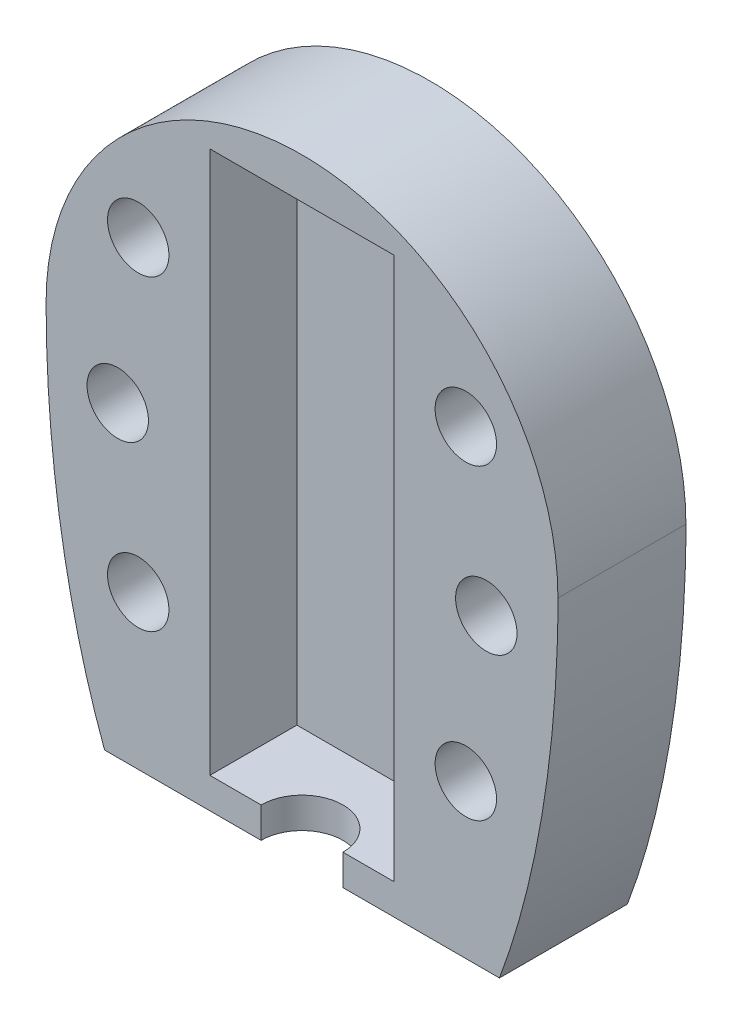
ISO-10303-21;
HEADER;
FILE_DESCRIPTION(('STEP AP214'),'2;1');
FILE_NAME('part.step','',(''),(''),'','','');
FILE_SCHEMA(('AUTOMOTIVE_DESIGN { 1 0 10303 214 1 1 1 1 }'));
ENDSEC;
DATA;
#1=APPLICATION_CONTEXT('core data for automotive mechanical design processes');
#2=APPLICATION_PROTOCOL_DEFINITION('international standard','automotive_design',2000,#1);
#3=PRODUCT_CONTEXT('',#1,'mechanical');
#4=PRODUCT('Part','Part','',(#3));
#5=PRODUCT_RELATED_PRODUCT_CATEGORY('part','',(#4));
#6=PRODUCT_DEFINITION_FORMATION('','',#4);
#7=PRODUCT_DEFINITION_CONTEXT('part definition',#1,'design');
#8=PRODUCT_DEFINITION('design','',#6,#7);
#9=PRODUCT_DEFINITION_SHAPE('','',#8);
#10=(LENGTH_UNIT() NAMED_UNIT(*) SI_UNIT(.MILLI.,.METRE.));
#11=(NAMED_UNIT(*) PLANE_ANGLE_UNIT() SI_UNIT($,.RADIAN.));
#12=(NAMED_UNIT(*) SI_UNIT($,.STERADIAN.) SOLID_ANGLE_UNIT());
#13=UNCERTAINTY_MEASURE_WITH_UNIT(LENGTH_MEASURE(1.E-05),#10,'distance_accuracy_value','');
#14=(GEOMETRIC_REPRESENTATION_CONTEXT(3) GLOBAL_UNCERTAINTY_ASSIGNED_CONTEXT((#13)) GLOBAL_UNIT_ASSIGNED_CONTEXT((#10,
#11,#12)) REPRESENTATION_CONTEXT('',''));
#15=CARTESIAN_POINT('',(0.,0.,0.));
#16=DIRECTION('',(0.,0.,1.));
#17=DIRECTION('',(1.,0.,0.));
#18=AXIS2_PLACEMENT_3D('',#15,#16,#17);
#19=CARTESIAN_POINT('',(0.,0.,12.5));
#20=DIRECTION('',(0.,0.,1.));
#21=DIRECTION('',(0.,-1.,0.));
#22=AXIS2_PLACEMENT_3D('',#19,#20,#21);
#23=ELLIPSE('',#22,55.,25.);
#24=DIRECTION('',(0.,0.,-1.));
#25=VECTOR('',#24,1.);
#26=SURFACE_OF_LINEAR_EXTRUSION('',#23,#25);
#27=CARTESIAN_POINT('',(0.,0.,0.));
#28=DIRECTION('',(0.,0.,1.));
#29=DIRECTION('',(0.,-1.,0.));
#30=AXIS2_PLACEMENT_3D('',#27,#28,#29);
#31=ELLIPSE('',#30,55.,25.);
#32=CARTESIAN_POINT('',(19.2847303959968,-35.,0.));
#33=VERTEX_POINT('',#32);
#34=CARTESIAN_POINT('',(25.,0.,0.));
#35=VERTEX_POINT('',#34);
#36=EDGE_CURVE('E138',#33,#35,#31,.T.);
#37=ORIENTED_EDGE('',*,*,#36,.T.);
#38=DIRECTION('',(0.,0.,-1.));
#39=VECTOR('',#38,1.);
#40=CARTESIAN_POINT('',(25.,0.,12.5));
#41=LINE('',#40,#39);
#42=CARTESIAN_POINT('',(25.,0.,12.5));
#43=VERTEX_POINT('',#42);
#44=EDGE_CURVE('E41',#43,#35,#41,.T.);
#45=ORIENTED_EDGE('',*,*,#44,.F.);
#46=CARTESIAN_POINT('',(19.2847303959968,-35.,12.5));
#47=VERTEX_POINT('',#46);
#48=EDGE_CURVE('E148',#47,#43,#23,.T.);
#49=ORIENTED_EDGE('',*,*,#48,.F.);
#50=DIRECTION('',(0.,0.,-1.));
#51=VECTOR('',#50,1.);
#52=CARTESIAN_POINT('',(19.2847303959968,-35.,12.5));
#53=LINE('',#52,#51);
#54=EDGE_CURVE('E128',#47,#33,#53,.T.);
#55=ORIENTED_EDGE('',*,*,#54,.T.);
#56=EDGE_LOOP('',(#37,#45,#49,#55));
#57=FACE_BOUND('',#56,.T.);
#58=ADVANCED_FACE('F33',(#57),#26,.F.);
#59=CARTESIAN_POINT('',(0.,0.,12.5));
#60=DIRECTION('',(0.,0.,-1.));
#61=DIRECTION('',(-1.,0.,0.));
#62=AXIS2_PLACEMENT_3D('',#59,#60,#61);
#63=CYLINDRICAL_SURFACE('',#62,25.);
#64=CARTESIAN_POINT('',(0.,0.,0.));
#65=DIRECTION('',(0.,0.,1.));
#66=DIRECTION('',(1.,0.,0.));
#67=AXIS2_PLACEMENT_3D('',#64,#65,#66);
#68=CIRCLE('',#67,25.);
#69=CARTESIAN_POINT('',(-25.,0.,0.));
#70=VERTEX_POINT('',#69);
#71=EDGE_CURVE('E141',#35,#70,#68,.T.);
#72=ORIENTED_EDGE('',*,*,#71,.T.);
#73=DIRECTION('',(0.,0.,-1.));
#74=VECTOR('',#73,1.);
#75=CARTESIAN_POINT('',(-25.,0.,12.5));
#76=LINE('',#75,#74);
#77=CARTESIAN_POINT('',(-25.,0.,12.5));
#78=VERTEX_POINT('',#77);
#79=EDGE_CURVE('E153',#78,#70,#76,.T.);
#80=ORIENTED_EDGE('',*,*,#79,.F.);
#81=CARTESIAN_POINT('',(0.,0.,12.5));
#82=DIRECTION('',(0.,0.,1.));
#83=DIRECTION('',(1.,0.,0.));
#84=AXIS2_PLACEMENT_3D('',#81,#82,#83);
#85=CIRCLE('',#84,25.);
#86=EDGE_CURVE('E133',#43,#78,#85,.T.);
#87=ORIENTED_EDGE('',*,*,#86,.F.);
#88=ORIENTED_EDGE('',*,*,#44,.T.);
#89=EDGE_LOOP('',(#72,#80,#87,#88));
#90=FACE_BOUND('',#89,.T.);
#91=ADVANCED_FACE('F158',(#90),#63,.T.);
#92=CARTESIAN_POINT('',(0.,0.,12.5));
#93=DIRECTION('',(0.,0.,1.));
#94=DIRECTION('',(0.,-1.,0.));
#95=AXIS2_PLACEMENT_3D('',#92,#93,#94);
#96=ELLIPSE('',#95,55.,25.);
#97=DIRECTION('',(0.,0.,-1.));
#98=VECTOR('',#97,1.);
#99=SURFACE_OF_LINEAR_EXTRUSION('',#96,#98);
#100=CARTESIAN_POINT('',(0.,0.,0.));
#101=DIRECTION('',(0.,0.,1.));
#102=DIRECTION('',(0.,-1.,0.));
#103=AXIS2_PLACEMENT_3D('',#100,#101,#102);
#104=ELLIPSE('',#103,55.,25.);
#105=CARTESIAN_POINT('',(-19.2847303959968,-35.,0.));
#106=VERTEX_POINT('',#105);
#107=EDGE_CURVE('E144',#70,#106,#104,.T.);
#108=ORIENTED_EDGE('',*,*,#107,.T.);
#109=DIRECTION('',(0.,0.,-1.));
#110=VECTOR('',#109,1.);
#111=CARTESIAN_POINT('',(-19.2847303959968,-35.,12.5));
#112=LINE('',#111,#110);
#113=CARTESIAN_POINT('',(-19.2847303959968,-35.,12.5));
#114=VERTEX_POINT('',#113);
#115=EDGE_CURVE('E150',#114,#106,#112,.T.);
#116=ORIENTED_EDGE('',*,*,#115,.F.);
#117=EDGE_CURVE('E131',#78,#114,#96,.T.);
#118=ORIENTED_EDGE('',*,*,#117,.F.);
#119=ORIENTED_EDGE('',*,*,#79,.T.);
#120=EDGE_LOOP('',(#108,#116,#118,#119));
#121=FACE_BOUND('',#120,.T.);
#122=ADVANCED_FACE('F168',(#121),#99,.F.);
#123=CARTESIAN_POINT('',(-19.2847303959968,-35.,12.5));
#124=DIRECTION('',(0.,1.,0.));
#125=DIRECTION('',(0.,0.,1.));
#126=AXIS2_PLACEMENT_3D('',#123,#124,#125);
#127=PLANE('',#126);
#128=DIRECTION('',(1.,0.,0.));
#129=VECTOR('',#128,1.);
#130=CARTESIAN_POINT('',(-19.2847303959968,-35.,12.5));
#131=LINE('',#130,#129);
#132=CARTESIAN_POINT('',(4.,-35.,12.5));
#133=VERTEX_POINT('',#132);
#134=EDGE_CURVE('E121',#133,#47,#131,.T.);
#135=ORIENTED_EDGE('',*,*,#134,.F.);
#136=CARTESIAN_POINT('',(0.,-35.,12.5));
#137=DIRECTION('',(0.,-1.,0.));
#138=DIRECTION('',(0.,0.,-1.));
#139=AXIS2_PLACEMENT_3D('',#136,#137,#138);
#140=CIRCLE('',#139,4.);
#141=CARTESIAN_POINT('',(-4.,-35.,12.5));
#142=VERTEX_POINT('',#141);
#143=EDGE_CURVE('E107',#142,#133,#140,.T.);
#144=ORIENTED_EDGE('',*,*,#143,.F.);
#145=EDGE_CURVE('E130',#114,#142,#131,.T.);
#146=ORIENTED_EDGE('',*,*,#145,.F.);
#147=ORIENTED_EDGE('',*,*,#115,.T.);
#148=DIRECTION('',(1.,0.,0.));
#149=VECTOR('',#148,1.);
#150=CARTESIAN_POINT('',(-19.2847303959968,-35.,0.));
#151=LINE('',#150,#149);
#152=EDGE_CURVE('E146',#106,#33,#151,.T.);
#153=ORIENTED_EDGE('',*,*,#152,.T.);
#154=ORIENTED_EDGE('',*,*,#54,.F.);
#155=EDGE_LOOP('',(#135,#144,#146,#147,#153,#154));
#156=FACE_BOUND('',#155,.T.);
#157=ADVANCED_FACE('F126',(#156),#127,.F.);
#158=CARTESIAN_POINT('',(0.,0.,12.5));
#159=DIRECTION('',(0.,0.,1.));
#160=DIRECTION('',(1.,0.,0.));
#161=AXIS2_PLACEMENT_3D('',#158,#159,#160);
#162=PLANE('',#161);
#163=CARTESIAN_POINT('',(-16.,-20.,12.5));
#164=DIRECTION('',(0.,0.,1.));
#165=DIRECTION('',(1.,0.,0.));
#166=AXIS2_PLACEMENT_3D('',#163,#164,#165);
#167=CIRCLE('',#166,3.);
#168=CARTESIAN_POINT('',(-13.,-20.,12.5));
#169=VERTEX_POINT('',#168);
#170=EDGE_CURVE('E222',#169,#169,#167,.T.);
#171=ORIENTED_EDGE('',*,*,#170,.F.);
#172=EDGE_LOOP('',(#171));
#173=FACE_BOUND('',#172,.T.);
#174=CARTESIAN_POINT('',(18.,-5.,12.5));
#175=DIRECTION('',(0.,0.,1.));
#176=DIRECTION('',(1.,0.,0.));
#177=AXIS2_PLACEMENT_3D('',#174,#175,#176);
#178=CIRCLE('',#177,2.99999999999999);
#179=CARTESIAN_POINT('',(21.,-5.,12.5));
#180=VERTEX_POINT('',#179);
#181=EDGE_CURVE('E229',#180,#180,#178,.T.);
#182=ORIENTED_EDGE('',*,*,#181,.F.);
#183=EDGE_LOOP('',(#182));
#184=FACE_BOUND('',#183,.T.);
#185=CARTESIAN_POINT('',(-18.,-5.,12.5));
#186=DIRECTION('',(0.,0.,1.));
#187=DIRECTION('',(1.,0.,0.));
#188=AXIS2_PLACEMENT_3D('',#185,#186,#187);
#189=CIRCLE('',#188,3.);
#190=CARTESIAN_POINT('',(-15.,-5.,12.5));
#191=VERTEX_POINT('',#190);
#192=EDGE_CURVE('E210',#191,#191,#189,.T.);
#193=ORIENTED_EDGE('',*,*,#192,.F.);
#194=EDGE_LOOP('',(#193));
#195=FACE_BOUND('',#194,.T.);
#196=CARTESIAN_POINT('',(16.,10.,12.5));
#197=DIRECTION('',(0.,0.,1.));
#198=DIRECTION('',(1.,0.,0.));
#199=AXIS2_PLACEMENT_3D('',#196,#197,#198);
#200=CIRCLE('',#199,3.);
#201=CARTESIAN_POINT('',(19.,10.,12.5));
#202=VERTEX_POINT('',#201);
#203=EDGE_CURVE('E217',#202,#202,#200,.T.);
#204=ORIENTED_EDGE('',*,*,#203,.F.);
#205=EDGE_LOOP('',(#204));
#206=FACE_BOUND('',#205,.T.);
#207=CARTESIAN_POINT('',(-16.,10.,12.5));
#208=DIRECTION('',(0.,0.,1.));
#209=DIRECTION('',(1.,0.,0.));
#210=AXIS2_PLACEMENT_3D('',#207,#208,#209);
#211=CIRCLE('',#210,3.);
#212=CARTESIAN_POINT('',(-13.,10.,12.5));
#213=VERTEX_POINT('',#212);
#214=EDGE_CURVE('E234',#213,#213,#211,.T.);
#215=ORIENTED_EDGE('',*,*,#214,.F.);
#216=EDGE_LOOP('',(#215));
#217=FACE_BOUND('',#216,.T.);
#218=CARTESIAN_POINT('',(16.,-20.,12.5));
#219=DIRECTION('',(0.,0.,1.));
#220=DIRECTION('',(1.,0.,0.));
#221=AXIS2_PLACEMENT_3D('',#218,#219,#220);
#222=CIRCLE('',#221,3.);
#223=CARTESIAN_POINT('',(19.,-20.,12.5));
#224=VERTEX_POINT('',#223);
#225=EDGE_CURVE('E204',#224,#224,#222,.T.);
#226=ORIENTED_EDGE('',*,*,#225,.F.);
#227=EDGE_LOOP('',(#226));
#228=FACE_BOUND('',#227,.T.);
#229=DIRECTION('',(0.,-1.,0.));
#230=VECTOR('',#229,1.);
#231=CARTESIAN_POINT('',(-4.,-27.,12.5));
#232=LINE('',#231,#230);
#233=CARTESIAN_POINT('',(-4.,-32.,12.5));
#234=VERTEX_POINT('',#233);
#235=EDGE_CURVE('E110',#234,#142,#232,.T.);
#236=ORIENTED_EDGE('',*,*,#235,.F.);
#237=DIRECTION('',(1.,0.,0.));
#238=VECTOR('',#237,1.);
#239=CARTESIAN_POINT('',(-9.,-32.,12.5));
#240=LINE('',#239,#238);
#241=CARTESIAN_POINT('',(-9.,-32.,12.5));
#242=VERTEX_POINT('',#241);
#243=EDGE_CURVE('E190',#242,#234,#240,.T.);
#244=ORIENTED_EDGE('',*,*,#243,.F.);
#245=DIRECTION('',(0.,-1.,0.));
#246=VECTOR('',#245,1.);
#247=CARTESIAN_POINT('',(-9.,21.,12.5));
#248=LINE('',#247,#246);
#249=CARTESIAN_POINT('',(-9.,21.,12.5));
#250=VERTEX_POINT('',#249);
#251=EDGE_CURVE('E55',#250,#242,#248,.T.);
#252=ORIENTED_EDGE('',*,*,#251,.F.);
#253=DIRECTION('',(-1.,0.,0.));
#254=VECTOR('',#253,1.);
#255=CARTESIAN_POINT('',(-9.,21.,12.5));
#256=LINE('',#255,#254);
#257=CARTESIAN_POINT('',(9.,21.,12.5));
#258=VERTEX_POINT('',#257);
#259=EDGE_CURVE('E183',#258,#250,#256,.T.);
#260=ORIENTED_EDGE('',*,*,#259,.F.);
#261=DIRECTION('',(0.,1.,0.));
#262=VECTOR('',#261,1.);
#263=CARTESIAN_POINT('',(9.,21.,12.5));
#264=LINE('',#263,#262);
#265=CARTESIAN_POINT('',(9.,-32.,12.5));
#266=VERTEX_POINT('',#265);
#267=EDGE_CURVE('E187',#266,#258,#264,.T.);
#268=ORIENTED_EDGE('',*,*,#267,.F.);
#269=CARTESIAN_POINT('',(4.,-32.,12.5));
#270=VERTEX_POINT('',#269);
#271=EDGE_CURVE('E124',#270,#266,#240,.T.);
#272=ORIENTED_EDGE('',*,*,#271,.F.);
#273=DIRECTION('',(0.,-1.,0.));
#274=VECTOR('',#273,1.);
#275=CARTESIAN_POINT('',(4.,-27.,12.5));
#276=LINE('',#275,#274);
#277=EDGE_CURVE('E48',#133,#270,#276,.F.);
#278=ORIENTED_EDGE('',*,*,#277,.F.);
#279=ORIENTED_EDGE('',*,*,#134,.T.);
#280=ORIENTED_EDGE('',*,*,#48,.T.);
#281=ORIENTED_EDGE('',*,*,#86,.T.);
#282=ORIENTED_EDGE('',*,*,#117,.T.);
#283=ORIENTED_EDGE('',*,*,#145,.T.);
#284=EDGE_LOOP('',(#236,#244,#252,#260,#268,#272,#278,#279,#280,#281,#282,#283));
#285=FACE_BOUND('',#284,.T.);
#286=ADVANCED_FACE('F119',(#173,#184,#195,#206,#217,#228,#285),#162,.T.);
#287=CARTESIAN_POINT('',(0.,0.,0.));
#288=DIRECTION('',(0.,0.,1.));
#289=DIRECTION('',(1.,0.,0.));
#290=AXIS2_PLACEMENT_3D('',#287,#288,#289);
#291=PLANE('',#290);
#292=ORIENTED_EDGE('',*,*,#36,.F.);
#293=ORIENTED_EDGE('',*,*,#152,.F.);
#294=ORIENTED_EDGE('',*,*,#107,.F.);
#295=ORIENTED_EDGE('',*,*,#71,.F.);
#296=EDGE_LOOP('',(#292,#293,#294,#295));
#297=FACE_BOUND('',#296,.T.);
#298=ADVANCED_FACE('F164',(#297),#291,.F.);
#299=CARTESIAN_POINT('',(-9.,21.,4.));
#300=DIRECTION('',(-1.,0.,0.));
#301=DIRECTION('',(0.,-1.,0.));
#302=AXIS2_PLACEMENT_3D('',#299,#300,#301);
#303=PLANE('',#302);
#304=ORIENTED_EDGE('',*,*,#251,.T.);
#305=DIRECTION('',(0.,0.,1.));
#306=VECTOR('',#305,1.);
#307=CARTESIAN_POINT('',(-9.,-32.,4.));
#308=LINE('',#307,#306);
#309=CARTESIAN_POINT('',(-9.,-32.,4.));
#310=VERTEX_POINT('',#309);
#311=EDGE_CURVE('E174',#310,#242,#308,.T.);
#312=ORIENTED_EDGE('',*,*,#311,.F.);
#313=DIRECTION('',(0.,-1.,0.));
#314=VECTOR('',#313,1.);
#315=CARTESIAN_POINT('',(-9.,21.,4.));
#316=LINE('',#315,#314);
#317=CARTESIAN_POINT('',(-9.,21.,4.));
#318=VERTEX_POINT('',#317);
#319=EDGE_CURVE('E186',#318,#310,#316,.T.);
#320=ORIENTED_EDGE('',*,*,#319,.F.);
#321=DIRECTION('',(0.,0.,1.));
#322=VECTOR('',#321,1.);
#323=CARTESIAN_POINT('',(-9.,21.,4.));
#324=LINE('',#323,#322);
#325=EDGE_CURVE('E142',#318,#250,#324,.T.);
#326=ORIENTED_EDGE('',*,*,#325,.T.);
#327=EDGE_LOOP('',(#304,#312,#320,#326));
#328=FACE_BOUND('',#327,.T.);
#329=ADVANCED_FACE('F280',(#328),#303,.F.);
#330=CARTESIAN_POINT('',(-9.,21.,4.));
#331=DIRECTION('',(0.,1.,0.));
#332=DIRECTION('',(0.,0.,1.));
#333=AXIS2_PLACEMENT_3D('',#330,#331,#332);
#334=PLANE('',#333);
#335=ORIENTED_EDGE('',*,*,#259,.T.);
#336=ORIENTED_EDGE('',*,*,#325,.F.);
#337=DIRECTION('',(-1.,0.,0.));
#338=VECTOR('',#337,1.);
#339=CARTESIAN_POINT('',(-9.,21.,4.));
#340=LINE('',#339,#338);
#341=CARTESIAN_POINT('',(9.,21.,4.));
#342=VERTEX_POINT('',#341);
#343=EDGE_CURVE('E177',#342,#318,#340,.T.);
#344=ORIENTED_EDGE('',*,*,#343,.F.);
#345=DIRECTION('',(0.,0.,1.));
#346=VECTOR('',#345,1.);
#347=CARTESIAN_POINT('',(9.,21.,4.));
#348=LINE('',#347,#346);
#349=EDGE_CURVE('E180',#342,#258,#348,.T.);
#350=ORIENTED_EDGE('',*,*,#349,.T.);
#351=EDGE_LOOP('',(#335,#336,#344,#350));
#352=FACE_BOUND('',#351,.T.);
#353=ADVANCED_FACE('F284',(#352),#334,.F.);
#354=CARTESIAN_POINT('',(9.,21.,4.));
#355=DIRECTION('',(1.,0.,0.));
#356=DIRECTION('',(0.,1.,0.));
#357=AXIS2_PLACEMENT_3D('',#354,#355,#356);
#358=PLANE('',#357);
#359=ORIENTED_EDGE('',*,*,#267,.T.);
#360=ORIENTED_EDGE('',*,*,#349,.F.);
#361=DIRECTION('',(0.,1.,0.));
#362=VECTOR('',#361,1.);
#363=CARTESIAN_POINT('',(9.,21.,4.));
#364=LINE('',#363,#362);
#365=CARTESIAN_POINT('',(9.,-32.,4.));
#366=VERTEX_POINT('',#365);
#367=EDGE_CURVE('E195',#366,#342,#364,.T.);
#368=ORIENTED_EDGE('',*,*,#367,.F.);
#369=DIRECTION('',(0.,0.,1.));
#370=VECTOR('',#369,1.);
#371=CARTESIAN_POINT('',(9.,-32.,4.));
#372=LINE('',#371,#370);
#373=EDGE_CURVE('E176',#366,#266,#372,.T.);
#374=ORIENTED_EDGE('',*,*,#373,.T.);
#375=EDGE_LOOP('',(#359,#360,#368,#374));
#376=FACE_BOUND('',#375,.T.);
#377=ADVANCED_FACE('F288',(#376),#358,.F.);
#378=CARTESIAN_POINT('',(-9.,-32.,4.));
#379=DIRECTION('',(0.,-1.,0.));
#380=DIRECTION('',(0.,0.,-1.));
#381=AXIS2_PLACEMENT_3D('',#378,#379,#380);
#382=PLANE('',#381);
#383=ORIENTED_EDGE('',*,*,#243,.T.);
#384=CARTESIAN_POINT('',(0.,-32.,12.5));
#385=DIRECTION('',(0.,-1.,0.));
#386=DIRECTION('',(0.,0.,-1.));
#387=AXIS2_PLACEMENT_3D('',#384,#385,#386);
#388=CIRCLE('',#387,4.);
#389=EDGE_CURVE('E11',#234,#270,#388,.T.);
#390=ORIENTED_EDGE('',*,*,#389,.T.);
#391=ORIENTED_EDGE('',*,*,#271,.T.);
#392=ORIENTED_EDGE('',*,*,#373,.F.);
#393=DIRECTION('',(1.,0.,0.));
#394=VECTOR('',#393,1.);
#395=CARTESIAN_POINT('',(-9.,-32.,4.));
#396=LINE('',#395,#394);
#397=EDGE_CURVE('E198',#310,#366,#396,.T.);
#398=ORIENTED_EDGE('',*,*,#397,.F.);
#399=ORIENTED_EDGE('',*,*,#311,.T.);
#400=EDGE_LOOP('',(#383,#390,#391,#392,#398,#399));
#401=FACE_BOUND('',#400,.T.);
#402=ADVANCED_FACE('F285',(#401),#382,.F.);
#403=CARTESIAN_POINT('',(0.,0.,4.));
#404=DIRECTION('',(0.,0.,1.));
#405=DIRECTION('',(1.,0.,0.));
#406=AXIS2_PLACEMENT_3D('',#403,#404,#405);
#407=PLANE('',#406);
#408=ORIENTED_EDGE('',*,*,#319,.T.);
#409=ORIENTED_EDGE('',*,*,#397,.T.);
#410=ORIENTED_EDGE('',*,*,#367,.T.);
#411=ORIENTED_EDGE('',*,*,#343,.T.);
#412=EDGE_LOOP('',(#408,#409,#410,#411));
#413=FACE_BOUND('',#412,.T.);
#414=ADVANCED_FACE('F265',(#413),#407,.T.);
#415=CARTESIAN_POINT('',(0.,-27.,12.5));
#416=DIRECTION('',(0.,-1.,0.));
#417=DIRECTION('',(0.,0.,-1.));
#418=AXIS2_PLACEMENT_3D('',#415,#416,#417);
#419=CYLINDRICAL_SURFACE('',#418,4.);
#420=ORIENTED_EDGE('',*,*,#235,.T.);
#421=ORIENTED_EDGE('',*,*,#143,.T.);
#422=ORIENTED_EDGE('',*,*,#277,.T.);
#423=ORIENTED_EDGE('',*,*,#389,.F.);
#424=EDGE_LOOP('',(#420,#421,#422,#423));
#425=FACE_BOUND('',#424,.T.);
#426=ADVANCED_FACE('F108',(#425),#419,.F.);
#427=CARTESIAN_POINT('',(16.,-20.,3.8));
#428=DIRECTION('',(0.,0.,1.));
#429=DIRECTION('',(1.,0.,0.));
#430=AXIS2_PLACEMENT_3D('',#427,#428,#429);
#431=CYLINDRICAL_SURFACE('',#430,3.);
#432=CARTESIAN_POINT('',(16.,-20.,3.8));
#433=DIRECTION('',(0.,0.,1.));
#434=DIRECTION('',(1.,0.,0.));
#435=AXIS2_PLACEMENT_3D('',#432,#433,#434);
#436=CIRCLE('',#435,3.);
#437=CARTESIAN_POINT('',(19.,-20.,3.8));
#438=VERTEX_POINT('',#437);
#439=EDGE_CURVE('E115',#438,#438,#436,.T.);
#440=ORIENTED_EDGE('',*,*,#439,.F.);
#441=EDGE_LOOP('',(#440));
#442=FACE_BOUND('',#441,.T.);
#443=ORIENTED_EDGE('',*,*,#225,.T.);
#444=EDGE_LOOP('',(#443));
#445=FACE_BOUND('',#444,.T.);
#446=ADVANCED_FACE('F255',(#442,#445),#431,.F.);
#447=CARTESIAN_POINT('',(16.,-20.,3.8));
#448=DIRECTION('',(0.,0.,1.));
#449=DIRECTION('',(1.,0.,0.));
#450=AXIS2_PLACEMENT_3D('',#447,#448,#449);
#451=PLANE('',#450);
#452=ORIENTED_EDGE('',*,*,#439,.T.);
#453=EDGE_LOOP('',(#452));
#454=FACE_BOUND('',#453,.T.);
#455=ADVANCED_FACE('F245',(#454),#451,.T.);
#456=CARTESIAN_POINT('',(-16.,10.,3.8));
#457=DIRECTION('',(0.,0.,1.));
#458=DIRECTION('',(1.,0.,0.));
#459=AXIS2_PLACEMENT_3D('',#456,#457,#458);
#460=CYLINDRICAL_SURFACE('',#459,3.);
#461=CARTESIAN_POINT('',(-16.,10.,3.8));
#462=DIRECTION('',(0.,0.,1.));
#463=DIRECTION('',(1.,0.,0.));
#464=AXIS2_PLACEMENT_3D('',#461,#462,#463);
#465=CIRCLE('',#464,3.);
#466=CARTESIAN_POINT('',(-13.,10.,3.8));
#467=VERTEX_POINT('',#466);
#468=EDGE_CURVE('E226',#467,#467,#465,.T.);
#469=ORIENTED_EDGE('',*,*,#468,.F.);
#470=EDGE_LOOP('',(#469));
#471=FACE_BOUND('',#470,.T.);
#472=ORIENTED_EDGE('',*,*,#214,.T.);
#473=EDGE_LOOP('',(#472));
#474=FACE_BOUND('',#473,.T.);
#475=ADVANCED_FACE('F242',(#471,#474),#460,.F.);
#476=CARTESIAN_POINT('',(-16.,10.,3.8));
#477=DIRECTION('',(0.,0.,1.));
#478=DIRECTION('',(1.,0.,0.));
#479=AXIS2_PLACEMENT_3D('',#476,#477,#478);
#480=PLANE('',#479);
#481=ORIENTED_EDGE('',*,*,#468,.T.);
#482=EDGE_LOOP('',(#481));
#483=FACE_BOUND('',#482,.T.);
#484=ADVANCED_FACE('F240',(#483),#480,.T.);
#485=CARTESIAN_POINT('',(16.,10.,3.8));
#486=DIRECTION('',(0.,0.,1.));
#487=DIRECTION('',(1.,0.,0.));
#488=AXIS2_PLACEMENT_3D('',#485,#486,#487);
#489=CYLINDRICAL_SURFACE('',#488,3.);
#490=CARTESIAN_POINT('',(16.,10.,3.8));
#491=DIRECTION('',(0.,0.,1.));
#492=DIRECTION('',(1.,0.,0.));
#493=AXIS2_PLACEMENT_3D('',#490,#491,#492);
#494=CIRCLE('',#493,3.);
#495=CARTESIAN_POINT('',(19.,10.,3.8));
#496=VERTEX_POINT('',#495);
#497=EDGE_CURVE('E207',#496,#496,#494,.T.);
#498=ORIENTED_EDGE('',*,*,#497,.F.);
#499=EDGE_LOOP('',(#498));
#500=FACE_BOUND('',#499,.T.);
#501=ORIENTED_EDGE('',*,*,#203,.T.);
#502=EDGE_LOOP('',(#501));
#503=FACE_BOUND('',#502,.T.);
#504=ADVANCED_FACE('F348',(#500,#503),#489,.F.);
#505=CARTESIAN_POINT('',(16.,10.,3.8));
#506=DIRECTION('',(0.,0.,1.));
#507=DIRECTION('',(1.,0.,0.));
#508=AXIS2_PLACEMENT_3D('',#505,#506,#507);
#509=PLANE('',#508);
#510=ORIENTED_EDGE('',*,*,#497,.T.);
#511=EDGE_LOOP('',(#510));
#512=FACE_BOUND('',#511,.T.);
#513=ADVANCED_FACE('F357',(#512),#509,.T.);
#514=CARTESIAN_POINT('',(-18.,-5.,3.8));
#515=DIRECTION('',(0.,0.,1.));
#516=DIRECTION('',(1.,0.,0.));
#517=AXIS2_PLACEMENT_3D('',#514,#515,#516);
#518=CYLINDRICAL_SURFACE('',#517,3.);
#519=CARTESIAN_POINT('',(-18.,-5.,3.8));
#520=DIRECTION('',(0.,0.,1.));
#521=DIRECTION('',(1.,0.,0.));
#522=AXIS2_PLACEMENT_3D('',#519,#520,#521);
#523=CIRCLE('',#522,3.);
#524=CARTESIAN_POINT('',(-15.,-5.,3.8));
#525=VERTEX_POINT('',#524);
#526=EDGE_CURVE('E213',#525,#525,#523,.T.);
#527=ORIENTED_EDGE('',*,*,#526,.F.);
#528=EDGE_LOOP('',(#527));
#529=FACE_BOUND('',#528,.T.);
#530=ORIENTED_EDGE('',*,*,#192,.T.);
#531=EDGE_LOOP('',(#530));
#532=FACE_BOUND('',#531,.T.);
#533=ADVANCED_FACE('F367',(#529,#532),#518,.F.);
#534=CARTESIAN_POINT('',(-18.,-5.,3.8));
#535=DIRECTION('',(0.,0.,1.));
#536=DIRECTION('',(1.,0.,0.));
#537=AXIS2_PLACEMENT_3D('',#534,#535,#536);
#538=PLANE('',#537);
#539=ORIENTED_EDGE('',*,*,#526,.T.);
#540=EDGE_LOOP('',(#539));
#541=FACE_BOUND('',#540,.T.);
#542=ADVANCED_FACE('F377',(#541),#538,.T.);
#543=CARTESIAN_POINT('',(18.,-5.,3.8));
#544=DIRECTION('',(0.,0.,1.));
#545=DIRECTION('',(1.,0.,0.));
#546=AXIS2_PLACEMENT_3D('',#543,#544,#545);
#547=CYLINDRICAL_SURFACE('',#546,2.99999999999999);
#548=CARTESIAN_POINT('',(18.,-5.,3.8));
#549=DIRECTION('',(0.,0.,1.));
#550=DIRECTION('',(1.,0.,0.));
#551=AXIS2_PLACEMENT_3D('',#548,#549,#550);
#552=CIRCLE('',#551,2.99999999999999);
#553=CARTESIAN_POINT('',(21.,-5.,3.8));
#554=VERTEX_POINT('',#553);
#555=EDGE_CURVE('E214',#554,#554,#552,.T.);
#556=ORIENTED_EDGE('',*,*,#555,.F.);
#557=EDGE_LOOP('',(#556));
#558=FACE_BOUND('',#557,.T.);
#559=ORIENTED_EDGE('',*,*,#181,.T.);
#560=EDGE_LOOP('',(#559));
#561=FACE_BOUND('',#560,.T.);
#562=ADVANCED_FACE('F387',(#558,#561),#547,.F.);
#563=CARTESIAN_POINT('',(18.,-5.,3.8));
#564=DIRECTION('',(0.,0.,1.));
#565=DIRECTION('',(1.,0.,0.));
#566=AXIS2_PLACEMENT_3D('',#563,#564,#565);
#567=PLANE('',#566);
#568=ORIENTED_EDGE('',*,*,#555,.T.);
#569=EDGE_LOOP('',(#568));
#570=FACE_BOUND('',#569,.T.);
#571=ADVANCED_FACE('F397',(#570),#567,.T.);
#572=CARTESIAN_POINT('',(-16.,-20.,3.8));
#573=DIRECTION('',(0.,0.,1.));
#574=DIRECTION('',(1.,0.,0.));
#575=AXIS2_PLACEMENT_3D('',#572,#573,#574);
#576=CYLINDRICAL_SURFACE('',#575,3.);
#577=CARTESIAN_POINT('',(-16.,-20.,3.8));
#578=DIRECTION('',(0.,0.,1.));
#579=DIRECTION('',(1.,0.,0.));
#580=AXIS2_PLACEMENT_3D('',#577,#578,#579);
#581=CIRCLE('',#580,3.);
#582=CARTESIAN_POINT('',(-13.,-20.,3.8));
#583=VERTEX_POINT('',#582);
#584=EDGE_CURVE('E225',#583,#583,#581,.T.);
#585=ORIENTED_EDGE('',*,*,#584,.F.);
#586=EDGE_LOOP('',(#585));
#587=FACE_BOUND('',#586,.T.);
#588=ORIENTED_EDGE('',*,*,#170,.T.);
#589=EDGE_LOOP('',(#588));
#590=FACE_BOUND('',#589,.T.);
#591=ADVANCED_FACE('F407',(#587,#590),#576,.F.);
#592=CARTESIAN_POINT('',(-16.,-20.,3.8));
#593=DIRECTION('',(0.,0.,1.));
#594=DIRECTION('',(1.,0.,0.));
#595=AXIS2_PLACEMENT_3D('',#592,#593,#594);
#596=PLANE('',#595);
#597=ORIENTED_EDGE('',*,*,#584,.T.);
#598=EDGE_LOOP('',(#597));
#599=FACE_BOUND('',#598,.T.);
#600=ADVANCED_FACE('F417',(#599),#596,.T.);
#601=CLOSED_SHELL('',(#58,#91,#122,#157,#286,#298,#329,#353,#377,#402,#414,#426,#446,#455,#475,
#484,#504,#513,#533,#542,#562,#571,#591,#600));
#602=MANIFOLD_SOLID_BREP('B2',#601);
#603=ADVANCED_BREP_SHAPE_REPRESENTATION('',(#18,#602),#14);
#604=SHAPE_DEFINITION_REPRESENTATION(#9,#603);
ENDSEC;
END-ISO-10303-21;
